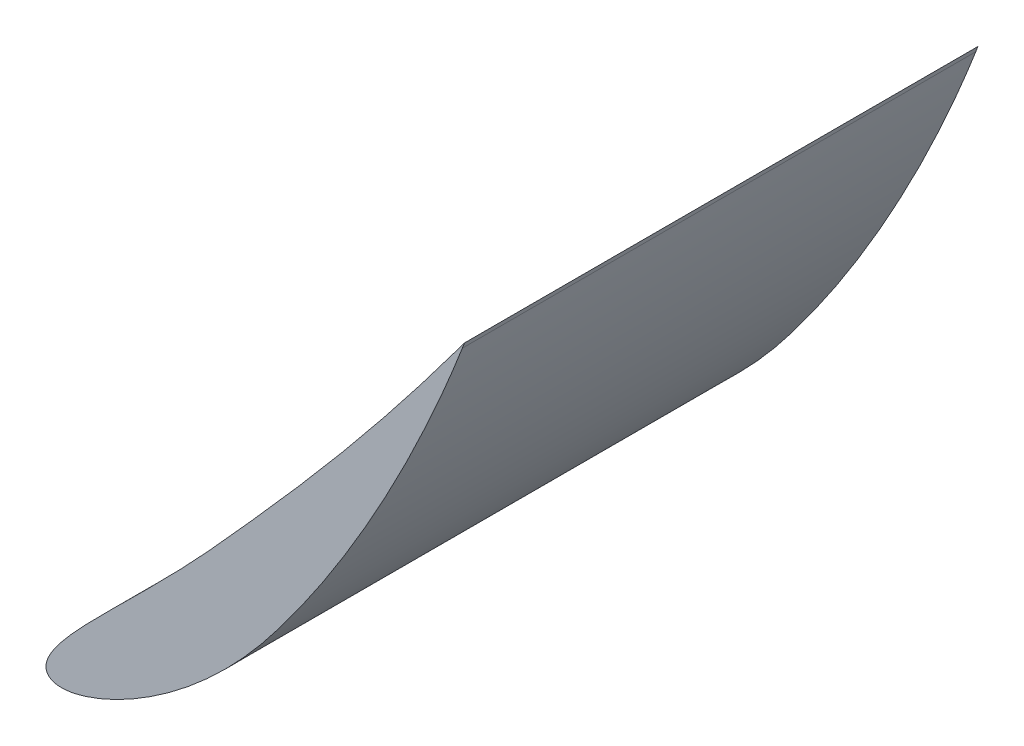
ISO-10303-21;
HEADER;
FILE_DESCRIPTION(('STEP AP214'),'2;1');
FILE_NAME('part.step','',(''),(''),'','','');
FILE_SCHEMA(('AUTOMOTIVE_DESIGN { 1 0 10303 214 1 1 1 1 }'));
ENDSEC;
DATA;
#1=APPLICATION_CONTEXT('core data for automotive mechanical design processes');
#2=APPLICATION_PROTOCOL_DEFINITION('international standard','automotive_design',2000,#1);
#3=PRODUCT_CONTEXT('',#1,'mechanical');
#4=PRODUCT('Part','Part','',(#3));
#5=PRODUCT_RELATED_PRODUCT_CATEGORY('part','',(#4));
#6=PRODUCT_DEFINITION_FORMATION('','',#4);
#7=PRODUCT_DEFINITION_CONTEXT('part definition',#1,'design');
#8=PRODUCT_DEFINITION('design','',#6,#7);
#9=PRODUCT_DEFINITION_SHAPE('','',#8);
#10=(LENGTH_UNIT() NAMED_UNIT(*) SI_UNIT(.MILLI.,.METRE.));
#11=(NAMED_UNIT(*) PLANE_ANGLE_UNIT() SI_UNIT($,.RADIAN.));
#12=(NAMED_UNIT(*) SI_UNIT($,.STERADIAN.) SOLID_ANGLE_UNIT());
#13=UNCERTAINTY_MEASURE_WITH_UNIT(LENGTH_MEASURE(1.E-05),#10,'distance_accuracy_value','');
#14=(GEOMETRIC_REPRESENTATION_CONTEXT(3) GLOBAL_UNCERTAINTY_ASSIGNED_CONTEXT((#13)) GLOBAL_UNIT_ASSIGNED_CONTEXT((#10,
#11,#12)) REPRESENTATION_CONTEXT('',''));
#15=CARTESIAN_POINT('',(0.,0.,0.));
#16=DIRECTION('',(0.,0.,1.));
#17=DIRECTION('',(1.,0.,0.));
#18=AXIS2_PLACEMENT_3D('',#15,#16,#17);
#19=CARTESIAN_POINT('',(81.5114443447214,97.3905028588164,101.6));
#20=CARTESIAN_POINT('',(81.4724993485904,97.3380225949964,101.6));
#21=CARTESIAN_POINT('',(81.3169275021705,97.1283820158827,101.6));
#22=CARTESIAN_POINT('',(80.9673240105217,96.6582939535566,101.6));
#23=CARTESIAN_POINT('',(80.3866634497469,95.8783557208887,101.6));
#24=CARTESIAN_POINT('',(79.5770452474423,94.7946632231762,101.6));
#25=CARTESIAN_POINT('',(78.5420168819516,93.4150335321203,101.6));
#26=CARTESIAN_POINT('',(77.2860055830285,91.7496774249787,101.6));
#27=CARTESIAN_POINT('',(75.8139822007672,89.811085714328,101.6));
#28=CARTESIAN_POINT('',(74.1325354546522,87.6134240911832,101.6));
#29=CARTESIAN_POINT('',(72.2484756306872,85.173105700979,101.6));
#30=CARTESIAN_POINT('',(70.1703117098976,82.5078774760904,101.6));
#31=CARTESIAN_POINT('',(67.9066182566043,79.6376394273435,101.6));
#32=CARTESIAN_POINT('',(65.4680439404062,76.5828753592974,101.6));
#33=CARTESIAN_POINT('',(62.8659029490468,73.3655234144295,101.6));
#34=CARTESIAN_POINT('',(60.1132970015813,70.0079239798094,101.6));
#35=CARTESIAN_POINT('',(57.224003934688,66.5334424291232,101.6));
#36=CARTESIAN_POINT('',(54.214433494237,62.9647475783509,101.6));
#37=CARTESIAN_POINT('',(51.1016295950607,59.3250196994085,101.6));
#38=CARTESIAN_POINT('',(47.904878914804,55.6367857888698,101.6));
#39=CARTESIAN_POINT('',(44.6451849265602,51.9215492818983,101.6));
#40=CARTESIAN_POINT('',(41.3442542622628,48.200989973003,101.6));
#41=CARTESIAN_POINT('',(38.0268826260598,44.4942411623332,101.6));
#42=CARTESIAN_POINT('',(34.7151331807116,40.8229057150131,101.6));
#43=CARTESIAN_POINT('',(31.4437054803405,37.1956194014633,101.6));
#44=CARTESIAN_POINT('',(28.1716511772458,33.689144272971,101.6));
#45=CARTESIAN_POINT('',(24.9329675553549,30.3129564992293,101.6));
#46=CARTESIAN_POINT('',(21.7584613379498,27.0784007511719,101.6));
#47=CARTESIAN_POINT('',(18.680606539026,23.994591950362,101.6));
#48=CARTESIAN_POINT('',(15.7314203046224,21.06951333977,101.6));
#49=CARTESIAN_POINT('',(12.9427394417428,18.3096104806926,101.6));
#50=CARTESIAN_POINT('',(10.3447106753002,15.7209159734472,101.6));
#51=CARTESIAN_POINT('',(7.96645250791072,13.308114525057,101.6));
#52=CARTESIAN_POINT('',(5.83397860759154,11.0762653040573,101.6));
#53=CARTESIAN_POINT('',(3.9718012371945,9.0290764036871,101.6));
#54=CARTESIAN_POINT('',(2.40061268825594,7.1703754864227,101.6));
#55=CARTESIAN_POINT('',(1.13795411614651,5.5031230482489,101.6));
#56=CARTESIAN_POINT('',(0.196818823955751,4.02854127904879,101.6));
#57=CARTESIAN_POINT('',(-0.413303284674985,2.74288328760045,101.6));
#58=CARTESIAN_POINT('',(-0.688610929824668,1.63206193677624,101.6));
#59=CARTESIAN_POINT('',(-0.579008281910862,0.660655586255031,101.6));
#60=CARTESIAN_POINT('',(-0.01340114277953,-0.0818041355518172,101.6));
#61=CARTESIAN_POINT('',(0.896547455097208,-0.525082577923026,101.6));
#62=CARTESIAN_POINT('',(2.0899547098991,-0.700909761060795,101.6));
#63=CARTESIAN_POINT('',(3.56512361435132,-0.632851232224614,101.6));
#64=CARTESIAN_POINT('',(5.32149888486379,-0.320057439984938,101.6));
#65=CARTESIAN_POINT('',(7.34744690523965,0.242219484071431,101.6));
#66=CARTESIAN_POINT('',(9.62319691470315,1.06131285816329,101.6));
#67=CARTESIAN_POINT('',(12.1246315617029,2.14234662593492,101.6));
#68=CARTESIAN_POINT('',(14.8236928496724,3.490992147618,101.6));
#69=CARTESIAN_POINT('',(17.6904455460199,5.1107765009458,101.6));
#70=CARTESIAN_POINT('',(20.6931764793858,7.00404357682187,101.6));
#71=CARTESIAN_POINT('',(23.7993302752129,9.17140481500294,101.6));
#72=CARTESIAN_POINT('',(26.9767119808995,11.6104836738946,101.6));
#73=CARTESIAN_POINT('',(30.1932055782075,14.3169861719907,101.6));
#74=CARTESIAN_POINT('',(33.4182576468309,17.2830944674401,101.6));
#75=CARTESIAN_POINT('',(36.6226503417414,20.4983758726733,101.6));
#76=CARTESIAN_POINT('',(39.7791575955441,23.9490027515416,101.6));
#77=CARTESIAN_POINT('',(42.8637366967801,27.6176498034936,101.6));
#78=CARTESIAN_POINT('',(45.8490898411578,31.4846984197134,101.6));
#79=CARTESIAN_POINT('',(48.7893665464483,35.469289230331,101.6));
#80=CARTESIAN_POINT('',(51.6592639694819,39.5528452886554,101.6));
#81=CARTESIAN_POINT('',(54.4471040122331,43.7050018335023,101.6));
#82=CARTESIAN_POINT('',(57.1391174349363,47.8972665535154,101.6));
#83=CARTESIAN_POINT('',(59.7244179754414,52.0990676484756,101.6));
#84=CARTESIAN_POINT('',(62.1920438941697,56.2803672723147,101.6));
#85=CARTESIAN_POINT('',(64.532921640334,60.4101269630917,101.6));
#86=CARTESIAN_POINT('',(66.7394203505399,64.4573537053992,101.6));
#87=CARTESIAN_POINT('',(68.8046325048246,68.3913550659398,101.6));
#88=CARTESIAN_POINT('',(70.7234345865292,72.1816303783077,101.6));
#89=CARTESIAN_POINT('',(72.491153274974,75.7986432311619,101.6));
#90=CARTESIAN_POINT('',(74.1049505837911,79.2134067515905,101.6));
#91=CARTESIAN_POINT('',(75.563174617972,82.3980510598886,101.6));
#92=CARTESIAN_POINT('',(76.864331348118,85.326520379045,101.6));
#93=CARTESIAN_POINT('',(78.0085992110131,87.9739739115741,101.6));
#94=CARTESIAN_POINT('',(78.9965168529994,90.3178191920208,101.6));
#95=CARTESIAN_POINT('',(79.8290460209961,92.3376130309087,101.6));
#96=CARTESIAN_POINT('',(80.5075030110646,94.0156040681829,101.6));
#97=CARTESIAN_POINT('',(81.0333649450307,95.3367164755296,101.6));
#98=CARTESIAN_POINT('',(81.4077281686149,96.2891718618193,101.6));
#99=CARTESIAN_POINT('',(81.6321320939616,96.8640427065085,101.6));
#100=CARTESIAN_POINT('',(81.7316792002867,97.1205494069967,101.6));
#101=CARTESIAN_POINT('',(81.7566085156607,97.1847856934033,101.6));
#102=B_SPLINE_CURVE_WITH_KNOTS('',3,(#19,#20,#21,#22,#23,#24,#25,#26,#27,#28,#29,#30,#31,#32,
#33,#34,#35,#36,#37,#38,#39,#40,#41,#42,#43,#44,#45,#46,#47,#48,#49,#50,#51,#52,#53,#54,#55,#56,
#57,#58,#59,#60,#61,#62,#63,#64,#65,#66,#67,#68,#69,#70,#71,#72,#73,#74,#75,#76,#77,#78,#79,#80,
#81,#82,#83,#84,#85,#86,#87,#88,#89,#90,#91,#92,#93,#94,#95,#96,#97,#98,#99,#100,#101),
.UNSPECIFIED.,.F.,.F.,(4,1,1,1,1,1,1,1,1,1,1,1,1,1,1,1,1,1,1,1,1,1,1,1,1,1,1,1,1,1,1,1,1,1,1,1,
1,1,1,1,1,1,1,1,1,1,1,1,1,1,1,1,1,1,1,1,1,1,1,1,1,1,1,1,1,1,1,1,1,1,1,1,1,1,1,1,1,1,1,1,4),(0.,
0.000750513501971195,0.00299804295428685,0.00672784940377236,0.0119171706525508,
0.0185329713263098,0.026534805613309,0.0358719389384909,0.0464868619139933,0.0583128283132623,
0.0712773849994469,0.0852994283936014,0.100292782778247,0.116165673834452,0.132819784938735,
0.150153116370067,0.168060493162749,0.18643095732459,0.205153508431755,0.224112105695577,
0.243191419595248,0.262273248918981,0.281238994312411,0.299973133201852,0.318367875682616,
0.336314444831389,0.353699728178519,0.370414229508711,0.386350073996083,0.401402198899796,
0.415472291888822,0.428468847070347,0.440308267572275,0.450919872749776,0.460245935875565,
0.468249663818777,0.47492187606895,0.480303629236668,0.484529405053291,0.487929891183724,
0.49113735242087,0.494782629666708,0.49927184258141,0.504867269579987,0.511674811850919,
0.519719915105306,0.528985613085521,0.539430032020974,0.550996930431098,0.563619975082369,
0.577228754188619,0.591747770545967,0.607101620883268,0.623214138669307,0.640007660113029,
0.657405010167299,0.675329003903349,0.693698678149423,0.712431881974785,0.731423114535592,
0.750564737004094,0.769745998457317,0.788854221163154,0.807776971836167,0.826399187090761,
0.844608489708695,0.862290408781229,0.879334612387501,0.895632214479611,0.911076793640884,
0.925566896965723,0.939005567967945,0.951300576603228,0.962367399370791,0.972127178235692,
0.9805106388094,0.987455983158366,0.992912933292426,0.996840179326193,0.999208694566608,1.),.UNSPECIFIED.);
#103=DIRECTION('',(0.,0.,-1.));
#104=VECTOR('',#103,1.);
#105=SURFACE_OF_LINEAR_EXTRUSION('',#102,#104);
#106=CARTESIAN_POINT('',(81.5114443447214,97.3905028588164,0.));
#107=CARTESIAN_POINT('',(81.4724993485904,97.3380225949964,0.));
#108=CARTESIAN_POINT('',(81.3169275021705,97.1283820158827,0.));
#109=CARTESIAN_POINT('',(80.9673240105217,96.6582939535566,0.));
#110=CARTESIAN_POINT('',(80.3866634497469,95.8783557208887,0.));
#111=CARTESIAN_POINT('',(79.5770452474423,94.7946632231762,0.));
#112=CARTESIAN_POINT('',(78.5420168819516,93.4150335321203,0.));
#113=CARTESIAN_POINT('',(77.2860055830285,91.7496774249787,0.));
#114=CARTESIAN_POINT('',(75.8139822007672,89.811085714328,0.));
#115=CARTESIAN_POINT('',(74.1325354546522,87.6134240911832,0.));
#116=CARTESIAN_POINT('',(72.2484756306872,85.173105700979,0.));
#117=CARTESIAN_POINT('',(70.1703117098976,82.5078774760904,0.));
#118=CARTESIAN_POINT('',(67.9066182566043,79.6376394273435,0.));
#119=CARTESIAN_POINT('',(65.4680439404062,76.5828753592974,0.));
#120=CARTESIAN_POINT('',(62.8659029490468,73.3655234144295,0.));
#121=CARTESIAN_POINT('',(60.1132970015813,70.0079239798094,0.));
#122=CARTESIAN_POINT('',(57.224003934688,66.5334424291232,0.));
#123=CARTESIAN_POINT('',(54.214433494237,62.9647475783509,0.));
#124=CARTESIAN_POINT('',(51.1016295950607,59.3250196994085,0.));
#125=CARTESIAN_POINT('',(47.904878914804,55.6367857888698,0.));
#126=CARTESIAN_POINT('',(44.6451849265602,51.9215492818983,0.));
#127=CARTESIAN_POINT('',(41.3442542622628,48.200989973003,0.));
#128=CARTESIAN_POINT('',(38.0268826260598,44.4942411623332,0.));
#129=CARTESIAN_POINT('',(34.7151331807116,40.8229057150131,0.));
#130=CARTESIAN_POINT('',(31.4437054803405,37.1956194014633,0.));
#131=CARTESIAN_POINT('',(28.1716511772458,33.689144272971,0.));
#132=CARTESIAN_POINT('',(24.9329675553549,30.3129564992293,0.));
#133=CARTESIAN_POINT('',(21.7584613379498,27.0784007511719,0.));
#134=CARTESIAN_POINT('',(18.680606539026,23.994591950362,0.));
#135=CARTESIAN_POINT('',(15.7314203046224,21.06951333977,0.));
#136=CARTESIAN_POINT('',(12.9427394417428,18.3096104806926,0.));
#137=CARTESIAN_POINT('',(10.3447106753002,15.7209159734472,0.));
#138=CARTESIAN_POINT('',(7.96645250791072,13.308114525057,0.));
#139=CARTESIAN_POINT('',(5.83397860759154,11.0762653040573,0.));
#140=CARTESIAN_POINT('',(3.9718012371945,9.0290764036871,0.));
#141=CARTESIAN_POINT('',(2.40061268825594,7.1703754864227,0.));
#142=CARTESIAN_POINT('',(1.13795411614651,5.5031230482489,0.));
#143=CARTESIAN_POINT('',(0.196818823955751,4.02854127904879,0.));
#144=CARTESIAN_POINT('',(-0.413303284674985,2.74288328760045,0.));
#145=CARTESIAN_POINT('',(-0.688610929824668,1.63206193677624,0.));
#146=CARTESIAN_POINT('',(-0.579008281910862,0.660655586255031,0.));
#147=CARTESIAN_POINT('',(-0.01340114277953,-0.0818041355518172,0.));
#148=CARTESIAN_POINT('',(0.896547455097208,-0.525082577923026,0.));
#149=CARTESIAN_POINT('',(2.0899547098991,-0.700909761060795,0.));
#150=CARTESIAN_POINT('',(3.56512361435132,-0.632851232224614,0.));
#151=CARTESIAN_POINT('',(5.32149888486379,-0.320057439984938,0.));
#152=CARTESIAN_POINT('',(7.34744690523965,0.242219484071431,0.));
#153=CARTESIAN_POINT('',(9.62319691470315,1.06131285816329,0.));
#154=CARTESIAN_POINT('',(12.1246315617029,2.14234662593492,0.));
#155=CARTESIAN_POINT('',(14.8236928496724,3.490992147618,0.));
#156=CARTESIAN_POINT('',(17.6904455460199,5.1107765009458,0.));
#157=CARTESIAN_POINT('',(20.6931764793858,7.00404357682187,0.));
#158=CARTESIAN_POINT('',(23.7993302752129,9.17140481500294,0.));
#159=CARTESIAN_POINT('',(26.9767119808995,11.6104836738946,0.));
#160=CARTESIAN_POINT('',(30.1932055782075,14.3169861719907,0.));
#161=CARTESIAN_POINT('',(33.4182576468309,17.2830944674401,0.));
#162=CARTESIAN_POINT('',(36.6226503417414,20.4983758726733,0.));
#163=CARTESIAN_POINT('',(39.7791575955441,23.9490027515416,0.));
#164=CARTESIAN_POINT('',(42.8637366967801,27.6176498034936,0.));
#165=CARTESIAN_POINT('',(45.8490898411578,31.4846984197134,0.));
#166=CARTESIAN_POINT('',(48.7893665464483,35.469289230331,0.));
#167=CARTESIAN_POINT('',(51.6592639694819,39.5528452886554,0.));
#168=CARTESIAN_POINT('',(54.4471040122331,43.7050018335023,0.));
#169=CARTESIAN_POINT('',(57.1391174349363,47.8972665535154,0.));
#170=CARTESIAN_POINT('',(59.7244179754414,52.0990676484756,0.));
#171=CARTESIAN_POINT('',(62.1920438941697,56.2803672723147,0.));
#172=CARTESIAN_POINT('',(64.532921640334,60.4101269630917,0.));
#173=CARTESIAN_POINT('',(66.7394203505399,64.4573537053992,0.));
#174=CARTESIAN_POINT('',(68.8046325048246,68.3913550659398,0.));
#175=CARTESIAN_POINT('',(70.7234345865292,72.1816303783077,0.));
#176=CARTESIAN_POINT('',(72.491153274974,75.7986432311619,0.));
#177=CARTESIAN_POINT('',(74.1049505837911,79.2134067515905,0.));
#178=CARTESIAN_POINT('',(75.563174617972,82.3980510598886,0.));
#179=CARTESIAN_POINT('',(76.864331348118,85.326520379045,0.));
#180=CARTESIAN_POINT('',(78.0085992110131,87.9739739115741,0.));
#181=CARTESIAN_POINT('',(78.9965168529994,90.3178191920208,0.));
#182=CARTESIAN_POINT('',(79.8290460209961,92.3376130309087,0.));
#183=CARTESIAN_POINT('',(80.5075030110646,94.0156040681829,0.));
#184=CARTESIAN_POINT('',(81.0333649450307,95.3367164755296,0.));
#185=CARTESIAN_POINT('',(81.4077281686149,96.2891718618193,0.));
#186=CARTESIAN_POINT('',(81.6321320939616,96.8640427065085,0.));
#187=CARTESIAN_POINT('',(81.7316792002867,97.1205494069967,0.));
#188=CARTESIAN_POINT('',(81.7566085156607,97.1847856934033,0.));
#189=B_SPLINE_CURVE_WITH_KNOTS('',3,(#106,#107,#108,#109,#110,#111,#112,#113,#114,#115,#116,
#117,#118,#119,#120,#121,#122,#123,#124,#125,#126,#127,#128,#129,#130,#131,#132,#133,#134,#135,
#136,#137,#138,#139,#140,#141,#142,#143,#144,#145,#146,#147,#148,#149,#150,#151,#152,#153,#154,
#155,#156,#157,#158,#159,#160,#161,#162,#163,#164,#165,#166,#167,#168,#169,#170,#171,#172,#173,
#174,#175,#176,#177,#178,#179,#180,#181,#182,#183,#184,#185,#186,#187,#188),.UNSPECIFIED.,.F.,
.F.,(4,1,1,1,1,1,1,1,1,1,1,1,1,1,1,1,1,1,1,1,1,1,1,1,1,1,1,1,1,1,1,1,1,1,1,1,1,1,1,1,1,1,1,1,1,
1,1,1,1,1,1,1,1,1,1,1,1,1,1,1,1,1,1,1,1,1,1,1,1,1,1,1,1,1,1,1,1,1,1,1,4),(0.,
0.000750513501971195,0.00299804295428685,0.00672784940377236,0.0119171706525508,
0.0185329713263098,0.026534805613309,0.0358719389384909,0.0464868619139933,0.0583128283132623,
0.0712773849994469,0.0852994283936014,0.100292782778247,0.116165673834452,0.132819784938735,
0.150153116370067,0.168060493162749,0.18643095732459,0.205153508431755,0.224112105695577,
0.243191419595248,0.262273248918981,0.281238994312411,0.299973133201852,0.318367875682616,
0.336314444831389,0.353699728178519,0.370414229508711,0.386350073996083,0.401402198899796,
0.415472291888822,0.428468847070347,0.440308267572275,0.450919872749776,0.460245935875565,
0.468249663818777,0.47492187606895,0.480303629236668,0.484529405053291,0.487929891183724,
0.49113735242087,0.494782629666708,0.49927184258141,0.504867269579987,0.511674811850919,
0.519719915105306,0.528985613085521,0.539430032020974,0.550996930431098,0.563619975082369,
0.577228754188619,0.591747770545967,0.607101620883268,0.623214138669307,0.640007660113029,
0.657405010167299,0.675329003903349,0.693698678149423,0.712431881974785,0.731423114535592,
0.750564737004094,0.769745998457317,0.788854221163154,0.807776971836167,0.826399187090761,
0.844608489708695,0.862290408781229,0.879334612387501,0.895632214479611,0.911076793640884,
0.925566896965723,0.939005567967945,0.951300576603228,0.962367399370791,0.972127178235692,
0.9805106388094,0.987455983158366,0.992912933292426,0.996840179326193,0.999208694566608,1.),.UNSPECIFIED.);
#190=CARTESIAN_POINT('',(81.5114443447213,97.3905028588163,0.));
#191=VERTEX_POINT('',#190);
#192=CARTESIAN_POINT('',(81.7566085156607,97.1847856934032,0.));
#193=VERTEX_POINT('',#192);
#194=EDGE_CURVE('E89',#191,#193,#189,.T.);
#195=ORIENTED_EDGE('',*,*,#194,.T.);
#196=DIRECTION('',(0.,0.,-1.));
#197=VECTOR('',#196,1.);
#198=CARTESIAN_POINT('',(81.7566085156607,97.1847856934032,101.6));
#199=LINE('',#198,#197);
#200=CARTESIAN_POINT('',(81.7566085156607,97.1847856934032,101.6));
#201=VERTEX_POINT('',#200);
#202=EDGE_CURVE('E13',#201,#193,#199,.T.);
#203=ORIENTED_EDGE('',*,*,#202,.F.);
#204=CARTESIAN_POINT('',(81.5114443447213,97.3905028588163,101.6));
#205=VERTEX_POINT('',#204);
#206=EDGE_CURVE('E83',#205,#201,#102,.T.);
#207=ORIENTED_EDGE('',*,*,#206,.F.);
#208=DIRECTION('',(0.,0.,-1.));
#209=VECTOR('',#208,1.);
#210=CARTESIAN_POINT('',(81.5114443447213,97.3905028588163,101.6));
#211=LINE('',#210,#209);
#212=EDGE_CURVE('E90',#205,#191,#211,.T.);
#213=ORIENTED_EDGE('',*,*,#212,.T.);
#214=EDGE_LOOP('',(#195,#203,#207,#213));
#215=FACE_BOUND('',#214,.T.);
#216=ADVANCED_FACE('F42',(#215),#105,.F.);
#217=CARTESIAN_POINT('',(81.7566085156607,97.1847856934032,101.6));
#218=DIRECTION('',(-0.932256741043418,0.361797414002788,0.));
#219=DIRECTION('',(-0.361797414002788,-0.932256741043418,0.));
#220=AXIS2_PLACEMENT_3D('',#217,#218,#219);
#221=PLANE('',#220);
#222=DIRECTION('',(0.361797414002788,0.932256741043418,0.));
#223=VECTOR('',#222,1.);
#224=CARTESIAN_POINT('',(81.7566085156607,97.1847856934032,0.));
#225=LINE('',#224,#223);
#226=CARTESIAN_POINT('',(82.1927399139845,98.3085815535499,0.));
#227=VERTEX_POINT('',#226);
#228=EDGE_CURVE('E71',#193,#227,#225,.T.);
#229=ORIENTED_EDGE('',*,*,#228,.T.);
#230=DIRECTION('',(0.,0.,-1.));
#231=VECTOR('',#230,1.);
#232=CARTESIAN_POINT('',(82.1927399139845,98.3085815535499,101.6));
#233=LINE('',#232,#231);
#234=CARTESIAN_POINT('',(82.1927399139845,98.3085815535499,101.6));
#235=VERTEX_POINT('',#234);
#236=EDGE_CURVE('E51',#235,#227,#233,.T.);
#237=ORIENTED_EDGE('',*,*,#236,.F.);
#238=DIRECTION('',(0.361797414002788,0.932256741043418,0.));
#239=VECTOR('',#238,1.);
#240=CARTESIAN_POINT('',(81.7566085156607,97.1847856934032,101.6));
#241=LINE('',#240,#239);
#242=EDGE_CURVE('E79',#201,#235,#241,.T.);
#243=ORIENTED_EDGE('',*,*,#242,.F.);
#244=ORIENTED_EDGE('',*,*,#202,.T.);
#245=EDGE_LOOP('',(#229,#237,#243,#244));
#246=FACE_BOUND('',#245,.T.);
#247=ADVANCED_FACE('F80',(#246),#221,.F.);
#248=CARTESIAN_POINT('',(81.5114443447213,97.3905028588163,101.6));
#249=DIRECTION('',(0.803039254555529,-0.595926132706815,0.));
#250=DIRECTION('',(0.595926132706815,0.803039254555529,0.));
#251=AXIS2_PLACEMENT_3D('',#248,#249,#250);
#252=PLANE('',#251);
#253=DIRECTION('',(-0.595926132706815,-0.803039254555529,0.));
#254=VECTOR('',#253,1.);
#255=CARTESIAN_POINT('',(81.5114443447213,97.3905028588163,0.));
#256=LINE('',#255,#254);
#257=EDGE_CURVE('E76',#227,#191,#256,.T.);
#258=ORIENTED_EDGE('',*,*,#257,.T.);
#259=ORIENTED_EDGE('',*,*,#212,.F.);
#260=DIRECTION('',(-0.595926132706815,-0.803039254555529,0.));
#261=VECTOR('',#260,1.);
#262=CARTESIAN_POINT('',(81.5114443447213,97.3905028588163,101.6));
#263=LINE('',#262,#261);
#264=EDGE_CURVE('E59',#235,#205,#263,.T.);
#265=ORIENTED_EDGE('',*,*,#264,.F.);
#266=ORIENTED_EDGE('',*,*,#236,.T.);
#267=EDGE_LOOP('',(#258,#259,#265,#266));
#268=FACE_BOUND('',#267,.T.);
#269=ADVANCED_FACE('F102',(#268),#252,.F.);
#270=CARTESIAN_POINT('',(2.18494371724588,-0.662101143585002,101.6));
#271=DIRECTION('',(0.,0.,1.));
#272=DIRECTION('',(1.,0.,0.));
#273=AXIS2_PLACEMENT_3D('',#270,#271,#272);
#274=PLANE('',#273);
#275=ORIENTED_EDGE('',*,*,#206,.T.);
#276=ORIENTED_EDGE('',*,*,#242,.T.);
#277=ORIENTED_EDGE('',*,*,#264,.T.);
#278=EDGE_LOOP('',(#275,#276,#277));
#279=FACE_BOUND('',#278,.T.);
#280=ADVANCED_FACE('F86',(#279),#274,.T.);
#281=CARTESIAN_POINT('',(2.18494371724588,-0.662101143585002,0.));
#282=DIRECTION('',(0.,0.,1.));
#283=DIRECTION('',(1.,0.,0.));
#284=AXIS2_PLACEMENT_3D('',#281,#282,#283);
#285=PLANE('',#284);
#286=ORIENTED_EDGE('',*,*,#194,.F.);
#287=ORIENTED_EDGE('',*,*,#257,.F.);
#288=ORIENTED_EDGE('',*,*,#228,.F.);
#289=EDGE_LOOP('',(#286,#287,#288));
#290=FACE_BOUND('',#289,.T.);
#291=ADVANCED_FACE('F103',(#290),#285,.F.);
#292=CLOSED_SHELL('',(#216,#247,#269,#280,#291));
#293=MANIFOLD_SOLID_BREP('B2',#292);
#294=ADVANCED_BREP_SHAPE_REPRESENTATION('',(#18,#293),#14);
#295=SHAPE_DEFINITION_REPRESENTATION(#9,#294);
ENDSEC;
END-ISO-10303-21;
